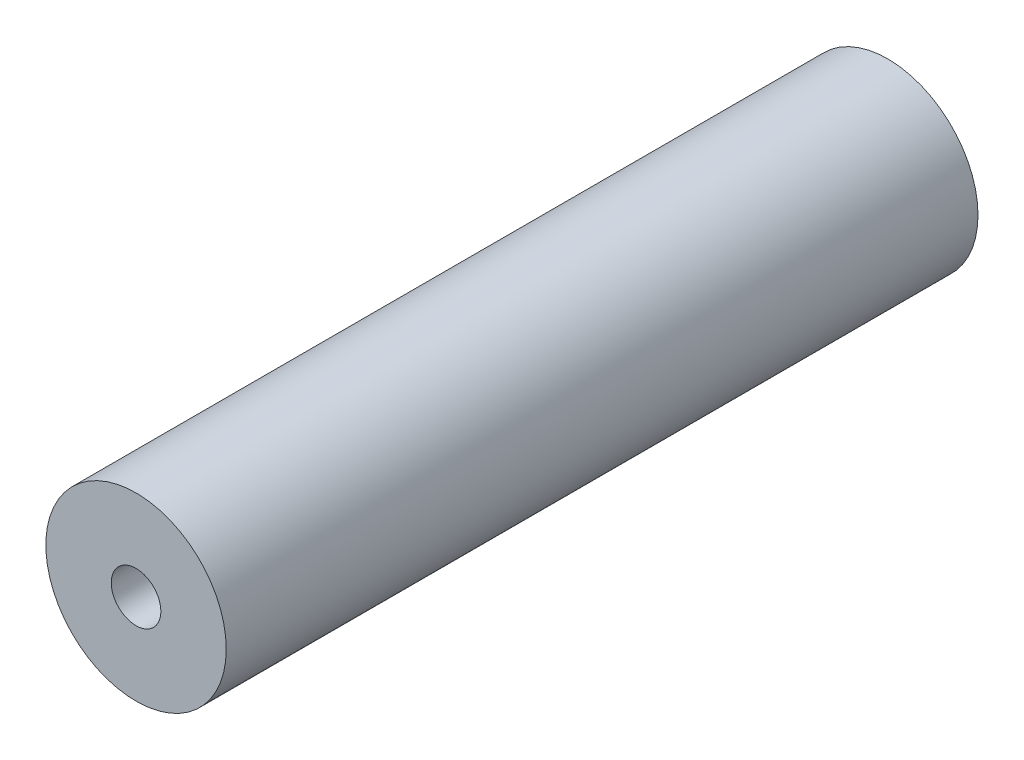
ISO-10303-21;
HEADER;
FILE_DESCRIPTION(('STEP AP214'),'2;1');
FILE_NAME('part.step','',(''),(''),'','','');
FILE_SCHEMA(('AUTOMOTIVE_DESIGN { 1 0 10303 214 1 1 1 1 }'));
ENDSEC;
DATA;
#1=APPLICATION_CONTEXT('core data for automotive mechanical design processes');
#2=APPLICATION_PROTOCOL_DEFINITION('international standard','automotive_design',2000,#1);
#3=PRODUCT_CONTEXT('',#1,'mechanical');
#4=PRODUCT('Part','Part','',(#3));
#5=PRODUCT_RELATED_PRODUCT_CATEGORY('part','',(#4));
#6=PRODUCT_DEFINITION_FORMATION('','',#4);
#7=PRODUCT_DEFINITION_CONTEXT('part definition',#1,'design');
#8=PRODUCT_DEFINITION('design','',#6,#7);
#9=PRODUCT_DEFINITION_SHAPE('','',#8);
#10=(LENGTH_UNIT() NAMED_UNIT(*) SI_UNIT(.MILLI.,.METRE.));
#11=(NAMED_UNIT(*) PLANE_ANGLE_UNIT() SI_UNIT($,.RADIAN.));
#12=(NAMED_UNIT(*) SI_UNIT($,.STERADIAN.) SOLID_ANGLE_UNIT());
#13=UNCERTAINTY_MEASURE_WITH_UNIT(LENGTH_MEASURE(1.E-05),#10,'distance_accuracy_value','');
#14=(GEOMETRIC_REPRESENTATION_CONTEXT(3) GLOBAL_UNCERTAINTY_ASSIGNED_CONTEXT((#13)) GLOBAL_UNIT_ASSIGNED_CONTEXT((#10,
#11,#12)) REPRESENTATION_CONTEXT('',''));
#15=CARTESIAN_POINT('',(0.,0.,0.));
#16=DIRECTION('',(0.,0.,1.));
#17=DIRECTION('',(1.,0.,0.));
#18=AXIS2_PLACEMENT_3D('',#15,#16,#17);
#19=CARTESIAN_POINT('',(0.,0.,50.));
#20=DIRECTION('',(0.,0.,-1.));
#21=DIRECTION('',(-1.,0.,0.));
#22=AXIS2_PLACEMENT_3D('',#19,#20,#21);
#23=CYLINDRICAL_SURFACE('',#22,6.);
#24=CARTESIAN_POINT('',(0.,0.,50.));
#25=DIRECTION('',(0.,0.,1.));
#26=DIRECTION('',(1.,0.,0.));
#27=AXIS2_PLACEMENT_3D('',#24,#25,#26);
#28=CIRCLE('',#27,6.);
#29=CARTESIAN_POINT('',(6.,0.,50.));
#30=VERTEX_POINT('',#29);
#31=EDGE_CURVE('E10',#30,#30,#28,.T.);
#32=ORIENTED_EDGE('',*,*,#31,.F.);
#33=EDGE_LOOP('',(#32));
#34=FACE_BOUND('',#33,.T.);
#35=CARTESIAN_POINT('',(0.,0.,0.));
#36=DIRECTION('',(0.,0.,1.));
#37=DIRECTION('',(1.,0.,0.));
#38=AXIS2_PLACEMENT_3D('',#35,#36,#37);
#39=CIRCLE('',#38,6.);
#40=CARTESIAN_POINT('',(6.,0.,0.));
#41=VERTEX_POINT('',#40);
#42=EDGE_CURVE('E34',#41,#41,#39,.T.);
#43=ORIENTED_EDGE('',*,*,#42,.T.);
#44=EDGE_LOOP('',(#43));
#45=FACE_BOUND('',#44,.T.);
#46=ADVANCED_FACE('F31',(#34,#45),#23,.T.);
#47=CARTESIAN_POINT('',(0.,0.,50.));
#48=DIRECTION('',(0.,0.,1.));
#49=DIRECTION('',(1.,0.,0.));
#50=AXIS2_PLACEMENT_3D('',#47,#48,#49);
#51=PLANE('',#50);
#52=CARTESIAN_POINT('',(0.,0.,50.));
#53=DIRECTION('',(0.,0.,1.));
#54=DIRECTION('',(1.,0.,0.));
#55=AXIS2_PLACEMENT_3D('',#52,#53,#54);
#56=CIRCLE('',#55,1.65);
#57=CARTESIAN_POINT('',(1.65,0.,50.));
#58=VERTEX_POINT('',#57);
#59=EDGE_CURVE('E43',#58,#58,#56,.T.);
#60=ORIENTED_EDGE('',*,*,#59,.F.);
#61=EDGE_LOOP('',(#60));
#62=FACE_BOUND('',#61,.T.);
#63=ORIENTED_EDGE('',*,*,#31,.T.);
#64=EDGE_LOOP('',(#63));
#65=FACE_BOUND('',#64,.T.);
#66=ADVANCED_FACE('F68',(#62,#65),#51,.T.);
#67=CARTESIAN_POINT('',(0.,0.,0.));
#68=DIRECTION('',(0.,0.,1.));
#69=DIRECTION('',(1.,0.,0.));
#70=AXIS2_PLACEMENT_3D('',#67,#68,#69);
#71=PLANE('',#70);
#72=CARTESIAN_POINT('',(0.,0.,0.));
#73=DIRECTION('',(0.,0.,-1.));
#74=DIRECTION('',(-1.,0.,0.));
#75=AXIS2_PLACEMENT_3D('',#72,#73,#74);
#76=CIRCLE('',#75,1.65);
#77=CARTESIAN_POINT('',(-1.65,0.,0.));
#78=VERTEX_POINT('',#77);
#79=EDGE_CURVE('E49',#78,#78,#76,.T.);
#80=ORIENTED_EDGE('',*,*,#79,.F.);
#81=EDGE_LOOP('',(#80));
#82=FACE_BOUND('',#81,.T.);
#83=ORIENTED_EDGE('',*,*,#42,.F.);
#84=EDGE_LOOP('',(#83));
#85=FACE_BOUND('',#84,.T.);
#86=ADVANCED_FACE('F64',(#82,#85),#71,.F.);
#87=CARTESIAN_POINT('',(0.,0.,35.));
#88=DIRECTION('',(0.,0.,1.));
#89=DIRECTION('',(1.,0.,0.));
#90=AXIS2_PLACEMENT_3D('',#87,#88,#89);
#91=CYLINDRICAL_SURFACE('',#90,1.65);
#92=CARTESIAN_POINT('',(0.,0.,35.));
#93=DIRECTION('',(0.,0.,1.));
#94=DIRECTION('',(1.,0.,0.));
#95=AXIS2_PLACEMENT_3D('',#92,#93,#94);
#96=CIRCLE('',#95,1.65);
#97=CARTESIAN_POINT('',(1.65,0.,35.));
#98=VERTEX_POINT('',#97);
#99=EDGE_CURVE('E41',#98,#98,#96,.T.);
#100=ORIENTED_EDGE('',*,*,#99,.F.);
#101=EDGE_LOOP('',(#100));
#102=FACE_BOUND('',#101,.T.);
#103=ORIENTED_EDGE('',*,*,#59,.T.);
#104=EDGE_LOOP('',(#103));
#105=FACE_BOUND('',#104,.T.);
#106=ADVANCED_FACE('F67',(#102,#105),#91,.F.);
#107=CARTESIAN_POINT('',(0.,0.,35.));
#108=DIRECTION('',(0.,0.,1.));
#109=DIRECTION('',(1.,0.,0.));
#110=AXIS2_PLACEMENT_3D('',#107,#108,#109);
#111=PLANE('',#110);
#112=ORIENTED_EDGE('',*,*,#99,.T.);
#113=EDGE_LOOP('',(#112));
#114=FACE_BOUND('',#113,.T.);
#115=ADVANCED_FACE('F60',(#114),#111,.T.);
#116=CARTESIAN_POINT('',(0.,0.,15.));
#117=DIRECTION('',(0.,0.,-1.));
#118=DIRECTION('',(-1.,0.,0.));
#119=AXIS2_PLACEMENT_3D('',#116,#117,#118);
#120=CYLINDRICAL_SURFACE('',#119,1.65);
#121=CARTESIAN_POINT('',(0.,0.,15.));
#122=DIRECTION('',(0.,0.,-1.));
#123=DIRECTION('',(-1.,0.,0.));
#124=AXIS2_PLACEMENT_3D('',#121,#122,#123);
#125=CIRCLE('',#124,1.65);
#126=CARTESIAN_POINT('',(-1.65,0.,15.));
#127=VERTEX_POINT('',#126);
#128=EDGE_CURVE('E46',#127,#127,#125,.T.);
#129=ORIENTED_EDGE('',*,*,#128,.F.);
#130=EDGE_LOOP('',(#129));
#131=FACE_BOUND('',#130,.T.);
#132=ORIENTED_EDGE('',*,*,#79,.T.);
#133=EDGE_LOOP('',(#132));
#134=FACE_BOUND('',#133,.T.);
#135=ADVANCED_FACE('F57',(#131,#134),#120,.F.);
#136=CARTESIAN_POINT('',(0.,0.,15.));
#137=DIRECTION('',(0.,0.,-1.));
#138=DIRECTION('',(-1.,0.,0.));
#139=AXIS2_PLACEMENT_3D('',#136,#137,#138);
#140=PLANE('',#139);
#141=ORIENTED_EDGE('',*,*,#128,.T.);
#142=EDGE_LOOP('',(#141));
#143=FACE_BOUND('',#142,.T.);
#144=ADVANCED_FACE('F55',(#143),#140,.T.);
#145=CLOSED_SHELL('',(#46,#66,#86,#106,#115,#135,#144));
#146=MANIFOLD_SOLID_BREP('B2',#145);
#147=ADVANCED_BREP_SHAPE_REPRESENTATION('',(#18,#146),#14);
#148=SHAPE_DEFINITION_REPRESENTATION(#9,#147);
ENDSEC;
END-ISO-10303-21;
